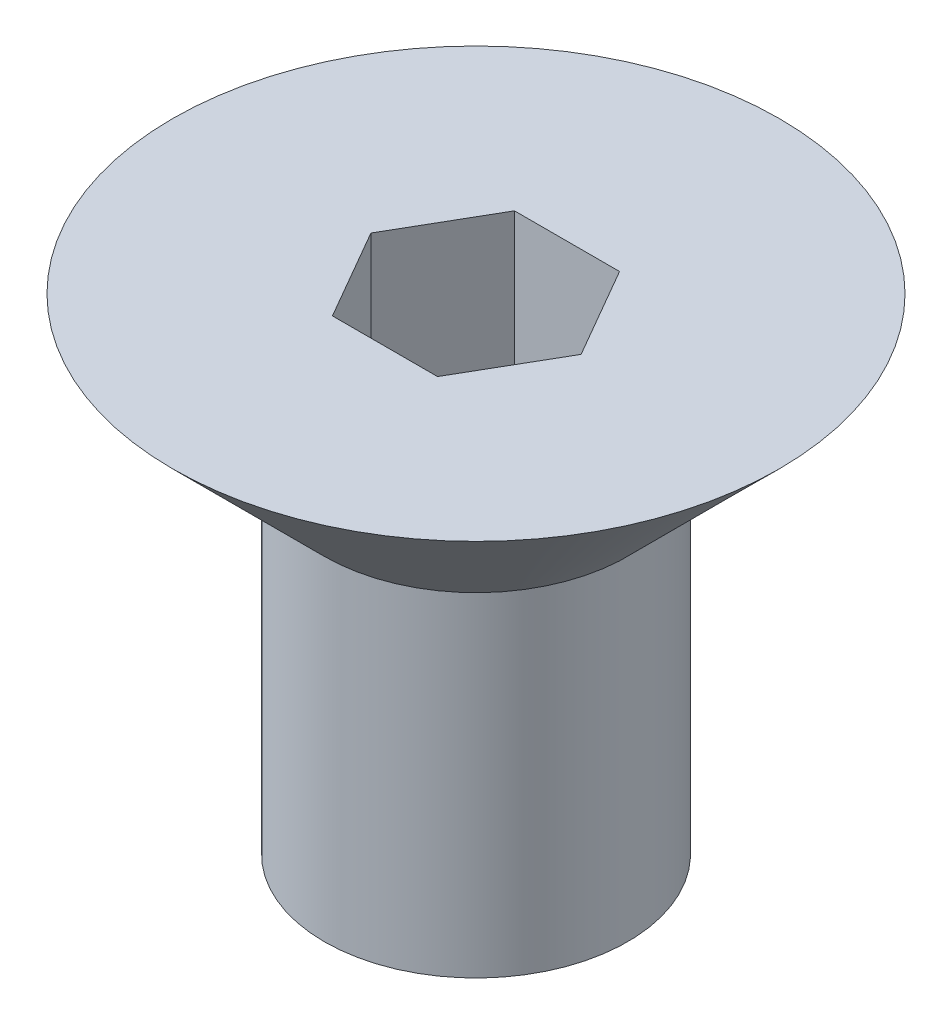
ISO-10303-21;
HEADER;
FILE_DESCRIPTION(('STEP AP214'),'2;1');
FILE_NAME('part.step','',(''),(''),'','','');
FILE_SCHEMA(('AUTOMOTIVE_DESIGN { 1 0 10303 214 1 1 1 1 }'));
ENDSEC;
DATA;
#1=APPLICATION_CONTEXT('core data for automotive mechanical design processes');
#2=APPLICATION_PROTOCOL_DEFINITION('international standard','automotive_design',2000,#1);
#3=PRODUCT_CONTEXT('',#1,'mechanical');
#4=PRODUCT('Part','Part','',(#3));
#5=PRODUCT_RELATED_PRODUCT_CATEGORY('part','',(#4));
#6=PRODUCT_DEFINITION_FORMATION('','',#4);
#7=PRODUCT_DEFINITION_CONTEXT('part definition',#1,'design');
#8=PRODUCT_DEFINITION('design','',#6,#7);
#9=PRODUCT_DEFINITION_SHAPE('','',#8);
#10=(LENGTH_UNIT() NAMED_UNIT(*) SI_UNIT(.MILLI.,.METRE.));
#11=(NAMED_UNIT(*) PLANE_ANGLE_UNIT() SI_UNIT($,.RADIAN.));
#12=(NAMED_UNIT(*) SI_UNIT($,.STERADIAN.) SOLID_ANGLE_UNIT());
#13=UNCERTAINTY_MEASURE_WITH_UNIT(LENGTH_MEASURE(1.E-05),#10,'distance_accuracy_value','');
#14=(GEOMETRIC_REPRESENTATION_CONTEXT(3) GLOBAL_UNCERTAINTY_ASSIGNED_CONTEXT((#13)) GLOBAL_UNIT_ASSIGNED_CONTEXT((#10,
#11,#12)) REPRESENTATION_CONTEXT('',''));
#15=CARTESIAN_POINT('',(0.,0.,0.));
#16=DIRECTION('',(0.,0.,1.));
#17=DIRECTION('',(1.,0.,0.));
#18=AXIS2_PLACEMENT_3D('',#15,#16,#17);
#19=CARTESIAN_POINT('',(0.,-16.,0.));
#20=DIRECTION('',(0.,1.,0.));
#21=DIRECTION('',(0.,0.,1.));
#22=AXIS2_PLACEMENT_3D('',#19,#20,#21);
#23=PLANE('',#22);
#24=CARTESIAN_POINT('',(0.,-16.,0.));
#25=DIRECTION('',(0.,1.,0.));
#26=DIRECTION('',(0.,0.,1.));
#27=AXIS2_PLACEMENT_3D('',#24,#25,#26);
#28=CIRCLE('',#27,5.00000000000001);
#29=CARTESIAN_POINT('',(0.,-16.,5.00000000000001));
#30=VERTEX_POINT('',#29);
#31=EDGE_CURVE('E11',#30,#30,#28,.T.);
#32=ORIENTED_EDGE('',*,*,#31,.F.);
#33=EDGE_LOOP('',(#32));
#34=FACE_BOUND('',#33,.T.);
#35=ADVANCED_FACE('F35',(#34),#23,.F.);
#36=CARTESIAN_POINT('',(0.,61.6916426261037,0.));
#37=DIRECTION('',(0.,1.,0.));
#38=DIRECTION('',(0.,0.,1.));
#39=AXIS2_PLACEMENT_3D('',#36,#37,#38);
#40=CYLINDRICAL_SURFACE('',#39,5.00000000000001);
#41=CARTESIAN_POINT('',(0.,-5.00000000000002,0.));
#42=DIRECTION('',(0.,1.,0.));
#43=DIRECTION('',(0.,0.,1.));
#44=AXIS2_PLACEMENT_3D('',#41,#42,#43);
#45=CIRCLE('',#44,5.00000000000001);
#46=CARTESIAN_POINT('',(0.,-5.00000000000002,5.00000000000001));
#47=VERTEX_POINT('',#46);
#48=EDGE_CURVE('E42',#47,#47,#45,.T.);
#49=ORIENTED_EDGE('',*,*,#48,.F.);
#50=EDGE_LOOP('',(#49));
#51=FACE_BOUND('',#50,.T.);
#52=ORIENTED_EDGE('',*,*,#31,.T.);
#53=EDGE_LOOP('',(#52));
#54=FACE_BOUND('',#53,.T.);
#55=ADVANCED_FACE('F148',(#51,#54),#40,.T.);
#56=CARTESIAN_POINT('',(0.,-5.00000000000002,0.));
#57=DIRECTION('',(0.,1.,0.));
#58=DIRECTION('',(0.,0.,1.));
#59=AXIS2_PLACEMENT_3D('',#56,#57,#58);
#60=CONICAL_SURFACE('',#59,5.00000000000001,0.785398163397446);
#61=CARTESIAN_POINT('',(0.,0.,0.));
#62=DIRECTION('',(0.,1.,0.));
#63=DIRECTION('',(0.,0.,1.));
#64=AXIS2_PLACEMENT_3D('',#61,#62,#63);
#65=CIRCLE('',#64,10.);
#66=CARTESIAN_POINT('',(0.,0.,10.));
#67=VERTEX_POINT('',#66);
#68=EDGE_CURVE('E136',#67,#67,#65,.T.);
#69=ORIENTED_EDGE('',*,*,#68,.F.);
#70=EDGE_LOOP('',(#69));
#71=FACE_BOUND('',#70,.T.);
#72=ORIENTED_EDGE('',*,*,#48,.T.);
#73=EDGE_LOOP('',(#72));
#74=FACE_BOUND('',#73,.T.);
#75=ADVANCED_FACE('F146',(#71,#74),#60,.T.);
#76=CARTESIAN_POINT('',(10.,0.,0.));
#77=DIRECTION('',(0.,-1.,0.));
#78=DIRECTION('',(0.,0.,-1.));
#79=AXIS2_PLACEMENT_3D('',#76,#77,#78);
#80=PLANE('',#79);
#81=DIRECTION('',(-1.,0.,0.));
#82=VECTOR('',#81,1.);
#83=CARTESIAN_POINT('',(1.73205080756888,0.,-3.));
#84=LINE('',#83,#82);
#85=CARTESIAN_POINT('',(1.73205080756888,0.,-3.));
#86=VERTEX_POINT('',#85);
#87=CARTESIAN_POINT('',(-1.73205080756888,0.,-3.));
#88=VERTEX_POINT('',#87);
#89=EDGE_CURVE('E123',#86,#88,#84,.T.);
#90=ORIENTED_EDGE('',*,*,#89,.F.);
#91=DIRECTION('',(-0.5,0.,-0.866025403784439));
#92=VECTOR('',#91,1.);
#93=CARTESIAN_POINT('',(3.46410161513775,0.,0.));
#94=LINE('',#93,#92);
#95=CARTESIAN_POINT('',(3.46410161513775,0.,0.));
#96=VERTEX_POINT('',#95);
#97=EDGE_CURVE('E49',#96,#86,#94,.T.);
#98=ORIENTED_EDGE('',*,*,#97,.F.);
#99=DIRECTION('',(0.5,0.,-0.866025403784439));
#100=VECTOR('',#99,1.);
#101=CARTESIAN_POINT('',(1.73205080756888,0.,3.));
#102=LINE('',#101,#100);
#103=CARTESIAN_POINT('',(1.73205080756888,0.,3.));
#104=VERTEX_POINT('',#103);
#105=EDGE_CURVE('E132',#104,#96,#102,.T.);
#106=ORIENTED_EDGE('',*,*,#105,.F.);
#107=DIRECTION('',(1.,0.,0.));
#108=VECTOR('',#107,1.);
#109=CARTESIAN_POINT('',(-1.73205080756888,0.,3.));
#110=LINE('',#109,#108);
#111=CARTESIAN_POINT('',(-1.73205080756888,0.,3.));
#112=VERTEX_POINT('',#111);
#113=EDGE_CURVE('E130',#112,#104,#110,.T.);
#114=ORIENTED_EDGE('',*,*,#113,.F.);
#115=DIRECTION('',(0.5,0.,0.866025403784438));
#116=VECTOR('',#115,1.);
#117=CARTESIAN_POINT('',(-3.46410161513775,0.,0.));
#118=LINE('',#117,#116);
#119=CARTESIAN_POINT('',(-3.46410161513775,0.,0.));
#120=VERTEX_POINT('',#119);
#121=EDGE_CURVE('E97',#120,#112,#118,.T.);
#122=ORIENTED_EDGE('',*,*,#121,.F.);
#123=DIRECTION('',(-0.5,0.,0.866025403784439));
#124=VECTOR('',#123,1.);
#125=CARTESIAN_POINT('',(-1.73205080756888,0.,-3.));
#126=LINE('',#125,#124);
#127=EDGE_CURVE('E126',#88,#120,#126,.T.);
#128=ORIENTED_EDGE('',*,*,#127,.F.);
#129=EDGE_LOOP('',(#90,#98,#106,#114,#122,#128));
#130=FACE_BOUND('',#129,.T.);
#131=ORIENTED_EDGE('',*,*,#68,.T.);
#132=EDGE_LOOP('',(#131));
#133=FACE_BOUND('',#132,.T.);
#134=ADVANCED_FACE('F166',(#130,#133),#80,.F.);
#135=CARTESIAN_POINT('',(3.46410161513775,-5.,0.));
#136=DIRECTION('',(0.866025403784439,0.,-0.5));
#137=DIRECTION('',(-0.5,0.,-0.866025403784439));
#138=AXIS2_PLACEMENT_3D('',#135,#136,#137);
#139=PLANE('',#138);
#140=ORIENTED_EDGE('',*,*,#97,.T.);
#141=DIRECTION('',(0.,1.,0.));
#142=VECTOR('',#141,1.);
#143=CARTESIAN_POINT('',(1.73205080756888,-5.,-3.));
#144=LINE('',#143,#142);
#145=CARTESIAN_POINT('',(1.73205080756888,-5.,-3.));
#146=VERTEX_POINT('',#145);
#147=EDGE_CURVE('E79',#146,#86,#144,.T.);
#148=ORIENTED_EDGE('',*,*,#147,.F.);
#149=DIRECTION('',(-0.5,0.,-0.866025403784439));
#150=VECTOR('',#149,1.);
#151=CARTESIAN_POINT('',(3.46410161513775,-5.,0.));
#152=LINE('',#151,#150);
#153=CARTESIAN_POINT('',(3.46410161513775,-5.,0.));
#154=VERTEX_POINT('',#153);
#155=EDGE_CURVE('E134',#154,#146,#152,.T.);
#156=ORIENTED_EDGE('',*,*,#155,.F.);
#157=DIRECTION('',(0.,1.,0.));
#158=VECTOR('',#157,1.);
#159=CARTESIAN_POINT('',(3.46410161513775,-5.,0.));
#160=LINE('',#159,#158);
#161=EDGE_CURVE('E57',#154,#96,#160,.T.);
#162=ORIENTED_EDGE('',*,*,#161,.T.);
#163=EDGE_LOOP('',(#140,#148,#156,#162));
#164=FACE_BOUND('',#163,.T.);
#165=ADVANCED_FACE('F174',(#164),#139,.F.);
#166=CARTESIAN_POINT('',(1.73205080756888,-5.,3.));
#167=DIRECTION('',(0.866025403784439,0.,0.5));
#168=DIRECTION('',(0.5,0.,-0.866025403784439));
#169=AXIS2_PLACEMENT_3D('',#166,#167,#168);
#170=PLANE('',#169);
#171=ORIENTED_EDGE('',*,*,#105,.T.);
#172=ORIENTED_EDGE('',*,*,#161,.F.);
#173=DIRECTION('',(0.5,0.,-0.866025403784439));
#174=VECTOR('',#173,1.);
#175=CARTESIAN_POINT('',(1.73205080756888,-5.,3.));
#176=LINE('',#175,#174);
#177=CARTESIAN_POINT('',(1.73205080756888,-5.,3.));
#178=VERTEX_POINT('',#177);
#179=EDGE_CURVE('E109',#178,#154,#176,.T.);
#180=ORIENTED_EDGE('',*,*,#179,.F.);
#181=DIRECTION('',(0.,1.,0.));
#182=VECTOR('',#181,1.);
#183=CARTESIAN_POINT('',(1.73205080756888,-5.,3.));
#184=LINE('',#183,#182);
#185=EDGE_CURVE('E101',#178,#104,#184,.T.);
#186=ORIENTED_EDGE('',*,*,#185,.T.);
#187=EDGE_LOOP('',(#171,#172,#180,#186));
#188=FACE_BOUND('',#187,.T.);
#189=ADVANCED_FACE('F182',(#188),#170,.F.);
#190=CARTESIAN_POINT('',(-1.73205080756888,-5.,3.));
#191=DIRECTION('',(0.,0.,1.));
#192=DIRECTION('',(1.,0.,0.));
#193=AXIS2_PLACEMENT_3D('',#190,#191,#192);
#194=PLANE('',#193);
#195=ORIENTED_EDGE('',*,*,#113,.T.);
#196=ORIENTED_EDGE('',*,*,#185,.F.);
#197=DIRECTION('',(1.,0.,0.));
#198=VECTOR('',#197,1.);
#199=CARTESIAN_POINT('',(-1.73205080756888,-5.,3.));
#200=LINE('',#199,#198);
#201=CARTESIAN_POINT('',(-1.73205080756888,-5.,3.));
#202=VERTEX_POINT('',#201);
#203=EDGE_CURVE('E105',#202,#178,#200,.T.);
#204=ORIENTED_EDGE('',*,*,#203,.F.);
#205=DIRECTION('',(0.,1.,0.));
#206=VECTOR('',#205,1.);
#207=CARTESIAN_POINT('',(-1.73205080756888,-5.,3.));
#208=LINE('',#207,#206);
#209=EDGE_CURVE('E90',#202,#112,#208,.T.);
#210=ORIENTED_EDGE('',*,*,#209,.T.);
#211=EDGE_LOOP('',(#195,#196,#204,#210));
#212=FACE_BOUND('',#211,.T.);
#213=ADVANCED_FACE('F106',(#212),#194,.F.);
#214=CARTESIAN_POINT('',(-3.46410161513775,-5.,0.));
#215=DIRECTION('',(-0.866025403784438,0.,0.5));
#216=DIRECTION('',(0.5,0.,0.866025403784438));
#217=AXIS2_PLACEMENT_3D('',#214,#215,#216);
#218=PLANE('',#217);
#219=ORIENTED_EDGE('',*,*,#121,.T.);
#220=ORIENTED_EDGE('',*,*,#209,.F.);
#221=DIRECTION('',(0.5,0.,0.866025403784438));
#222=VECTOR('',#221,1.);
#223=CARTESIAN_POINT('',(-3.46410161513775,-5.,0.));
#224=LINE('',#223,#222);
#225=CARTESIAN_POINT('',(-3.46410161513775,-5.,0.));
#226=VERTEX_POINT('',#225);
#227=EDGE_CURVE('E94',#226,#202,#224,.T.);
#228=ORIENTED_EDGE('',*,*,#227,.F.);
#229=DIRECTION('',(0.,1.,0.));
#230=VECTOR('',#229,1.);
#231=CARTESIAN_POINT('',(-3.46410161513775,-5.,0.));
#232=LINE('',#231,#230);
#233=EDGE_CURVE('E102',#226,#120,#232,.T.);
#234=ORIENTED_EDGE('',*,*,#233,.T.);
#235=EDGE_LOOP('',(#219,#220,#228,#234));
#236=FACE_BOUND('',#235,.T.);
#237=ADVANCED_FACE('F92',(#236),#218,.F.);
#238=CARTESIAN_POINT('',(-1.73205080756888,-5.,-3.));
#239=DIRECTION('',(-0.866025403784439,0.,-0.5));
#240=DIRECTION('',(-0.5,0.,0.866025403784439));
#241=AXIS2_PLACEMENT_3D('',#238,#239,#240);
#242=PLANE('',#241);
#243=ORIENTED_EDGE('',*,*,#127,.T.);
#244=ORIENTED_EDGE('',*,*,#233,.F.);
#245=DIRECTION('',(-0.5,0.,0.866025403784439));
#246=VECTOR('',#245,1.);
#247=CARTESIAN_POINT('',(-1.73205080756888,-5.,-3.));
#248=LINE('',#247,#246);
#249=CARTESIAN_POINT('',(-1.73205080756888,-5.,-3.));
#250=VERTEX_POINT('',#249);
#251=EDGE_CURVE('E115',#250,#226,#248,.T.);
#252=ORIENTED_EDGE('',*,*,#251,.F.);
#253=DIRECTION('',(0.,1.,0.));
#254=VECTOR('',#253,1.);
#255=CARTESIAN_POINT('',(-1.73205080756888,-5.,-3.));
#256=LINE('',#255,#254);
#257=EDGE_CURVE('E139',#250,#88,#256,.T.);
#258=ORIENTED_EDGE('',*,*,#257,.T.);
#259=EDGE_LOOP('',(#243,#244,#252,#258));
#260=FACE_BOUND('',#259,.T.);
#261=ADVANCED_FACE('F201',(#260),#242,.F.);
#262=CARTESIAN_POINT('',(1.73205080756888,-5.,-3.));
#263=DIRECTION('',(0.,0.,-1.));
#264=DIRECTION('',(-1.,0.,0.));
#265=AXIS2_PLACEMENT_3D('',#262,#263,#264);
#266=PLANE('',#265);
#267=ORIENTED_EDGE('',*,*,#89,.T.);
#268=ORIENTED_EDGE('',*,*,#257,.F.);
#269=DIRECTION('',(-1.,0.,0.));
#270=VECTOR('',#269,1.);
#271=CARTESIAN_POINT('',(1.73205080756888,-5.,-3.));
#272=LINE('',#271,#270);
#273=EDGE_CURVE('E117',#146,#250,#272,.T.);
#274=ORIENTED_EDGE('',*,*,#273,.F.);
#275=ORIENTED_EDGE('',*,*,#147,.T.);
#276=EDGE_LOOP('',(#267,#268,#274,#275));
#277=FACE_BOUND('',#276,.T.);
#278=ADVANCED_FACE('F208',(#277),#266,.F.);
#279=CARTESIAN_POINT('',(5.19615242270663,-5.,3.));
#280=DIRECTION('',(0.,-1.,0.));
#281=DIRECTION('',(0.,0.,-1.));
#282=AXIS2_PLACEMENT_3D('',#279,#280,#281);
#283=PLANE('',#282);
#284=ORIENTED_EDGE('',*,*,#155,.T.);
#285=ORIENTED_EDGE('',*,*,#273,.T.);
#286=ORIENTED_EDGE('',*,*,#251,.T.);
#287=ORIENTED_EDGE('',*,*,#227,.T.);
#288=ORIENTED_EDGE('',*,*,#203,.T.);
#289=ORIENTED_EDGE('',*,*,#179,.T.);
#290=EDGE_LOOP('',(#284,#285,#286,#287,#288,#289));
#291=FACE_BOUND('',#290,.T.);
#292=ADVANCED_FACE('F112',(#291),#283,.F.);
#293=CLOSED_SHELL('',(#35,#55,#75,#134,#165,#189,#213,#237,#261,#278,#292));
#294=MANIFOLD_SOLID_BREP('B2',#293);
#295=ADVANCED_BREP_SHAPE_REPRESENTATION('',(#18,#294),#14);
#296=SHAPE_DEFINITION_REPRESENTATION(#9,#295);
ENDSEC;
END-ISO-10303-21;
